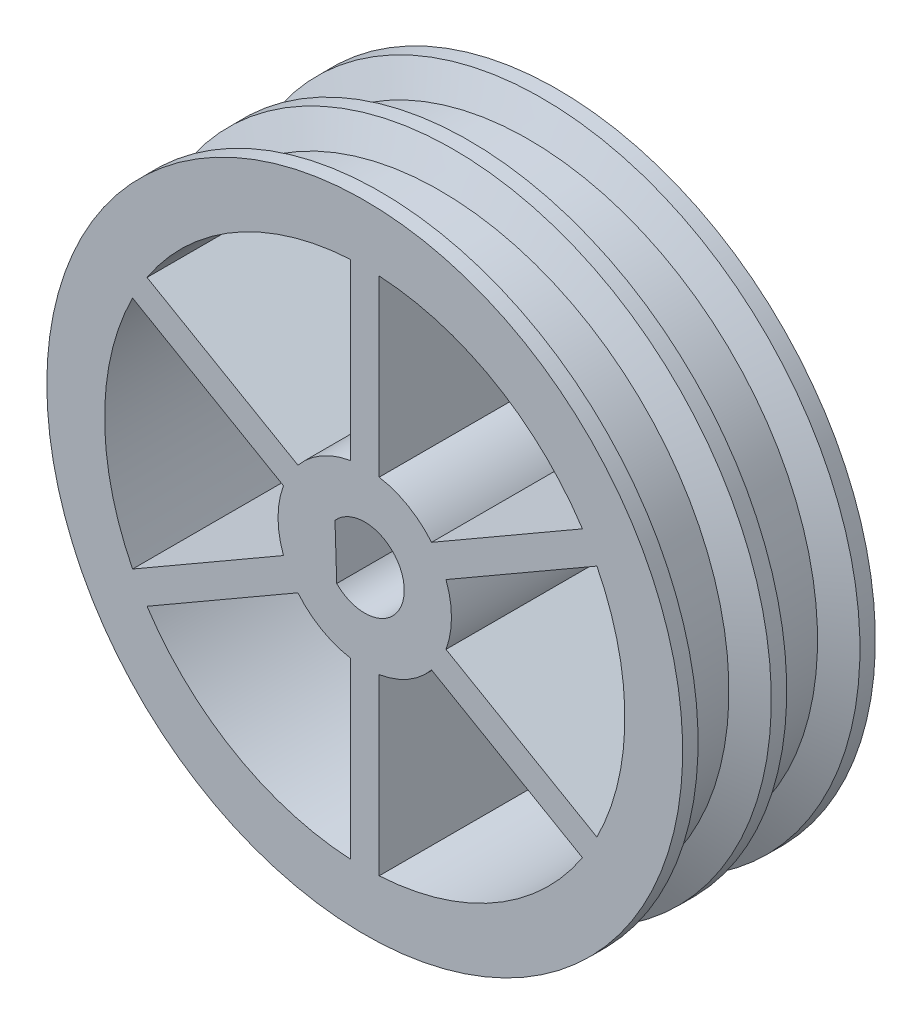
ISO-10303-21;
HEADER;
FILE_DESCRIPTION(('STEP AP214'),'2;1');
FILE_NAME('part.step','',(''),(''),'','','');
FILE_SCHEMA(('AUTOMOTIVE_DESIGN { 1 0 10303 214 1 1 1 1 }'));
ENDSEC;
DATA;
#1=APPLICATION_CONTEXT('core data for automotive mechanical design processes');
#2=APPLICATION_PROTOCOL_DEFINITION('international standard','automotive_design',2000,#1);
#3=PRODUCT_CONTEXT('',#1,'mechanical');
#4=PRODUCT('Part','Part','',(#3));
#5=PRODUCT_RELATED_PRODUCT_CATEGORY('part','',(#4));
#6=PRODUCT_DEFINITION_FORMATION('','',#4);
#7=PRODUCT_DEFINITION_CONTEXT('part definition',#1,'design');
#8=PRODUCT_DEFINITION('design','',#6,#7);
#9=PRODUCT_DEFINITION_SHAPE('','',#8);
#10=(LENGTH_UNIT() NAMED_UNIT(*) SI_UNIT(.MILLI.,.METRE.));
#11=(NAMED_UNIT(*) PLANE_ANGLE_UNIT() SI_UNIT($,.RADIAN.));
#12=(NAMED_UNIT(*) SI_UNIT($,.STERADIAN.) SOLID_ANGLE_UNIT());
#13=UNCERTAINTY_MEASURE_WITH_UNIT(LENGTH_MEASURE(1.E-05),#10,'distance_accuracy_value','');
#14=(GEOMETRIC_REPRESENTATION_CONTEXT(3) GLOBAL_UNCERTAINTY_ASSIGNED_CONTEXT((#13)) GLOBAL_UNIT_ASSIGNED_CONTEXT((#10,
#11,#12)) REPRESENTATION_CONTEXT('',''));
#15=CARTESIAN_POINT('',(0.,0.,0.));
#16=DIRECTION('',(0.,0.,1.));
#17=DIRECTION('',(1.,0.,0.));
#18=AXIS2_PLACEMENT_3D('',#15,#16,#17);
#19=CARTESIAN_POINT('',(0.,0.,20.));
#20=DIRECTION('',(0.,0.,-1.));
#21=DIRECTION('',(-1.,0.,0.));
#22=AXIS2_PLACEMENT_3D('',#19,#20,#21);
#23=CYLINDRICAL_SURFACE('',#22,30.);
#24=CARTESIAN_POINT('',(0.,0.,12.2));
#25=DIRECTION('',(0.,0.,-1.));
#26=DIRECTION('',(-1.,0.,0.));
#27=AXIS2_PLACEMENT_3D('',#24,#25,#26);
#28=CIRCLE('',#27,30.);
#29=CARTESIAN_POINT('',(-30.,0.,12.2));
#30=VERTEX_POINT('',#29);
#31=EDGE_CURVE('E640',#30,#30,#28,.T.);
#32=ORIENTED_EDGE('',*,*,#31,.F.);
#33=EDGE_LOOP('',(#32));
#34=FACE_BOUND('',#33,.T.);
#35=CARTESIAN_POINT('',(0.,0.,17.));
#36=DIRECTION('',(0.,0.,-1.));
#37=DIRECTION('',(-1.,0.,0.));
#38=AXIS2_PLACEMENT_3D('',#35,#36,#37);
#39=CIRCLE('',#38,30.);
#40=CARTESIAN_POINT('',(-30.,0.,17.));
#41=VERTEX_POINT('',#40);
#42=EDGE_CURVE('E501',#41,#41,#39,.T.);
#43=ORIENTED_EDGE('',*,*,#42,.T.);
#44=EDGE_LOOP('',(#43));
#45=FACE_BOUND('',#44,.T.);
#46=ADVANCED_FACE('F35',(#34,#45),#23,.T.);
#47=CARTESIAN_POINT('',(0.,0.,20.));
#48=DIRECTION('',(0.,0.,1.));
#49=DIRECTION('',(1.,0.,0.));
#50=AXIS2_PLACEMENT_3D('',#47,#48,#49);
#51=PLANE('',#50);
#52=DIRECTION('',(0.,1.,0.));
#53=VECTOR('',#52,1.);
#54=CARTESIAN_POINT('',(-1.5,26.9583011334171,20.));
#55=LINE('',#54,#53);
#56=CARTESIAN_POINT('',(-1.5,8.87411967464942,20.));
#57=VERTEX_POINT('',#56);
#58=CARTESIAN_POINT('',(-1.5,26.9583011334171,20.));
#59=VERTEX_POINT('',#58);
#60=EDGE_CURVE('E391',#57,#59,#55,.T.);
#61=ORIENTED_EDGE('',*,*,#60,.F.);
#62=CARTESIAN_POINT('',(0.,0.,20.));
#63=DIRECTION('',(0.,0.,-1.));
#64=DIRECTION('',(1.,0.,0.));
#65=AXIS2_PLACEMENT_3D('',#62,#63,#64);
#66=CIRCLE('',#65,9.);
#67=CARTESIAN_POINT('',(-6.93521307446963,5.73609794300145,20.));
#68=VERTEX_POINT('',#67);
#69=EDGE_CURVE('E389',#68,#57,#66,.T.);
#70=ORIENTED_EDGE('',*,*,#69,.F.);
#71=DIRECTION('',(0.866025403784433,-0.50000000000001,0.));
#72=VECTOR('',#71,1.);
#73=CARTESIAN_POINT('',(-22.5965736244099,14.7781886723855,20.));
#74=LINE('',#73,#72);
#75=CARTESIAN_POINT('',(-22.5965736244099,14.7781886723855,20.));
#76=VERTEX_POINT('',#75);
#77=EDGE_CURVE('E397',#76,#68,#74,.T.);
#78=ORIENTED_EDGE('',*,*,#77,.F.);
#79=CARTESIAN_POINT('',(0.,0.,20.));
#80=DIRECTION('',(0.,0.,1.));
#81=DIRECTION('',(1.,0.,0.));
#82=AXIS2_PLACEMENT_3D('',#79,#80,#81);
#83=CIRCLE('',#82,27.);
#84=EDGE_CURVE('E394',#59,#76,#83,.T.);
#85=ORIENTED_EDGE('',*,*,#84,.F.);
#86=EDGE_LOOP('',(#61,#70,#78,#85));
#87=FACE_BOUND('',#86,.T.);
#88=DIRECTION('',(0.86602540378444,0.499999999999998,0.));
#89=VECTOR('',#88,1.);
#90=CARTESIAN_POINT('',(22.5965736244101,14.7781886723852,20.));
#91=LINE('',#90,#89);
#92=CARTESIAN_POINT('',(6.93521307446971,5.73609794300136,20.));
#93=VERTEX_POINT('',#92);
#94=CARTESIAN_POINT('',(22.5965736244101,14.7781886723852,20.));
#95=VERTEX_POINT('',#94);
#96=EDGE_CURVE('E360',#93,#95,#91,.T.);
#97=ORIENTED_EDGE('',*,*,#96,.F.);
#98=CARTESIAN_POINT('',(0.,0.,20.));
#99=DIRECTION('',(0.,0.,-1.));
#100=DIRECTION('',(1.,0.,0.));
#101=AXIS2_PLACEMENT_3D('',#98,#99,#100);
#102=CIRCLE('',#101,9.);
#103=CARTESIAN_POINT('',(1.5,8.87411967464942,20.));
#104=VERTEX_POINT('',#103);
#105=EDGE_CURVE('E358',#104,#93,#102,.T.);
#106=ORIENTED_EDGE('',*,*,#105,.F.);
#107=DIRECTION('',(0.,-1.,0.));
#108=VECTOR('',#107,1.);
#109=CARTESIAN_POINT('',(1.5,26.9583011334171,20.));
#110=LINE('',#109,#108);
#111=CARTESIAN_POINT('',(1.5,26.9583011334171,20.));
#112=VERTEX_POINT('',#111);
#113=EDGE_CURVE('E366',#112,#104,#110,.T.);
#114=ORIENTED_EDGE('',*,*,#113,.F.);
#115=CARTESIAN_POINT('',(0.,0.,20.));
#116=DIRECTION('',(0.,0.,1.));
#117=DIRECTION('',(1.,0.,0.));
#118=AXIS2_PLACEMENT_3D('',#115,#116,#117);
#119=CIRCLE('',#118,27.);
#120=EDGE_CURVE('E363',#95,#112,#119,.T.);
#121=ORIENTED_EDGE('',*,*,#120,.F.);
#122=EDGE_LOOP('',(#97,#106,#114,#121));
#123=FACE_BOUND('',#122,.T.);
#124=DIRECTION('',(0.0322794332363587,-0.99947888331367,0.));
#125=VECTOR('',#124,1.);
#126=CARTESIAN_POINT('',(-3.08864597172414,2.6963430904379,20.));
#127=LINE('',#126,#125);
#128=CARTESIAN_POINT('',(-3.08864597172414,2.69634309043791,20.));
#129=VERTEX_POINT('',#128);
#130=CARTESIAN_POINT('',(-2.90822732815787,-2.89001968985606,20.));
#131=VERTEX_POINT('',#130);
#132=EDGE_CURVE('E344',#129,#131,#127,.T.);
#133=ORIENTED_EDGE('',*,*,#132,.F.);
#134=CARTESIAN_POINT('',(0.,0.,20.));
#135=DIRECTION('',(0.,0.,1.));
#136=DIRECTION('',(1.,0.,0.));
#137=AXIS2_PLACEMENT_3D('',#134,#135,#136);
#138=CIRCLE('',#137,4.1);
#139=EDGE_CURVE('E341',#131,#129,#138,.T.);
#140=ORIENTED_EDGE('',*,*,#139,.F.);
#141=EDGE_LOOP('',(#133,#140));
#142=FACE_BOUND('',#141,.T.);
#143=DIRECTION('',(-0.866025403784433,0.50000000000001,0.));
#144=VECTOR('',#143,1.);
#145=CARTESIAN_POINT('',(-24.0965736244099,12.1801124610322,20.));
#146=LINE('',#145,#144);
#147=CARTESIAN_POINT('',(-8.43521307446966,3.13802173164815,20.));
#148=VERTEX_POINT('',#147);
#149=CARTESIAN_POINT('',(-24.0965736244099,12.1801124610322,20.));
#150=VERTEX_POINT('',#149);
#151=EDGE_CURVE('E312',#148,#150,#146,.T.);
#152=ORIENTED_EDGE('',*,*,#151,.F.);
#153=CARTESIAN_POINT('',(0.,0.,20.));
#154=DIRECTION('',(0.,0.,-1.));
#155=DIRECTION('',(1.,0.,0.));
#156=AXIS2_PLACEMENT_3D('',#153,#154,#155);
#157=CIRCLE('',#156,9.);
#158=CARTESIAN_POINT('',(-8.43521307446973,-3.13802173164797,20.));
#159=VERTEX_POINT('',#158);
#160=EDGE_CURVE('E310',#159,#148,#157,.T.);
#161=ORIENTED_EDGE('',*,*,#160,.F.);
#162=DIRECTION('',(0.866025403784443,0.499999999999992,0.));
#163=VECTOR('',#162,1.);
#164=CARTESIAN_POINT('',(-24.0965736244102,-12.1801124610317,20.));
#165=LINE('',#164,#163);
#166=CARTESIAN_POINT('',(-24.0965736244102,-12.1801124610317,20.));
#167=VERTEX_POINT('',#166);
#168=EDGE_CURVE('E318',#167,#159,#165,.T.);
#169=ORIENTED_EDGE('',*,*,#168,.F.);
#170=CARTESIAN_POINT('',(0.,0.,20.));
#171=DIRECTION('',(0.,0.,1.));
#172=DIRECTION('',(1.,0.,0.));
#173=AXIS2_PLACEMENT_3D('',#170,#171,#172);
#174=CIRCLE('',#173,27.);
#175=EDGE_CURVE('E315',#150,#167,#174,.T.);
#176=ORIENTED_EDGE('',*,*,#175,.F.);
#177=EDGE_LOOP('',(#152,#161,#169,#176));
#178=FACE_BOUND('',#177,.T.);
#179=DIRECTION('',(0.866025403784436,-0.500000000000004,0.));
#180=VECTOR('',#179,1.);
#181=CARTESIAN_POINT('',(24.09657362441,-12.180112461032,20.));
#182=LINE('',#181,#180);
#183=CARTESIAN_POINT('',(8.43521307446969,-3.13802173164809,20.));
#184=VERTEX_POINT('',#183);
#185=CARTESIAN_POINT('',(24.09657362441,-12.180112461032,20.));
#186=VERTEX_POINT('',#185);
#187=EDGE_CURVE('E281',#184,#186,#182,.T.);
#188=ORIENTED_EDGE('',*,*,#187,.F.);
#189=CARTESIAN_POINT('',(0.,0.,20.));
#190=DIRECTION('',(0.,0.,-1.));
#191=DIRECTION('',(1.,0.,0.));
#192=AXIS2_PLACEMENT_3D('',#189,#190,#191);
#193=CIRCLE('',#192,9.);
#194=CARTESIAN_POINT('',(8.43521307446971,3.13802173164803,20.));
#195=VERTEX_POINT('',#194);
#196=EDGE_CURVE('E279',#195,#184,#193,.T.);
#197=ORIENTED_EDGE('',*,*,#196,.F.);
#198=DIRECTION('',(-0.86602540378444,-0.499999999999998,0.));
#199=VECTOR('',#198,1.);
#200=CARTESIAN_POINT('',(24.0965736244101,12.1801124610319,20.));
#201=LINE('',#200,#199);
#202=CARTESIAN_POINT('',(24.0965736244101,12.1801124610319,20.));
#203=VERTEX_POINT('',#202);
#204=EDGE_CURVE('E287',#203,#195,#201,.T.);
#205=ORIENTED_EDGE('',*,*,#204,.F.);
#206=CARTESIAN_POINT('',(0.,0.,20.));
#207=DIRECTION('',(0.,0.,1.));
#208=DIRECTION('',(1.,0.,0.));
#209=AXIS2_PLACEMENT_3D('',#206,#207,#208);
#210=CIRCLE('',#209,27.);
#211=EDGE_CURVE('E284',#186,#203,#210,.T.);
#212=ORIENTED_EDGE('',*,*,#211,.F.);
#213=EDGE_LOOP('',(#188,#197,#205,#212));
#214=FACE_BOUND('',#213,.T.);
#215=DIRECTION('',(-0.866025403784443,-0.499999999999992,0.));
#216=VECTOR('',#215,1.);
#217=CARTESIAN_POINT('',(-22.5965736244102,-14.778188672385,20.));
#218=LINE('',#217,#216);
#219=CARTESIAN_POINT('',(-6.93521307446975,-5.73609794300131,20.));
#220=VERTEX_POINT('',#219);
#221=CARTESIAN_POINT('',(-22.5965736244102,-14.778188672385,20.));
#222=VERTEX_POINT('',#221);
#223=EDGE_CURVE('E250',#220,#222,#218,.T.);
#224=ORIENTED_EDGE('',*,*,#223,.F.);
#225=CARTESIAN_POINT('',(0.,0.,20.));
#226=DIRECTION('',(0.,0.,-1.));
#227=DIRECTION('',(1.,0.,0.));
#228=AXIS2_PLACEMENT_3D('',#225,#226,#227);
#229=CIRCLE('',#228,9.);
#230=CARTESIAN_POINT('',(-1.50000000000006,-8.87411967464941,20.));
#231=VERTEX_POINT('',#230);
#232=EDGE_CURVE('E248',#231,#220,#229,.T.);
#233=ORIENTED_EDGE('',*,*,#232,.F.);
#234=DIRECTION('',(0.,1.,0.));
#235=VECTOR('',#234,1.);
#236=CARTESIAN_POINT('',(-1.50000000000019,-26.9583011334171,20.));
#237=LINE('',#236,#235);
#238=CARTESIAN_POINT('',(-1.50000000000019,-26.9583011334171,20.));
#239=VERTEX_POINT('',#238);
#240=EDGE_CURVE('E256',#239,#231,#237,.T.);
#241=ORIENTED_EDGE('',*,*,#240,.F.);
#242=CARTESIAN_POINT('',(0.,0.,20.));
#243=DIRECTION('',(0.,0.,1.));
#244=DIRECTION('',(1.,0.,0.));
#245=AXIS2_PLACEMENT_3D('',#242,#243,#244);
#246=CIRCLE('',#245,27.);
#247=EDGE_CURVE('E253',#222,#239,#246,.T.);
#248=ORIENTED_EDGE('',*,*,#247,.F.);
#249=EDGE_LOOP('',(#224,#233,#241,#248));
#250=FACE_BOUND('',#249,.T.);
#251=DIRECTION('',(0.,-1.,0.));
#252=VECTOR('',#251,1.);
#253=CARTESIAN_POINT('',(1.49999999999981,-26.9583011334172,20.));
#254=LINE('',#253,#252);
#255=CARTESIAN_POINT('',(1.49999999999994,-8.87411967464944,20.));
#256=VERTEX_POINT('',#255);
#257=CARTESIAN_POINT('',(1.4999999999998,-26.9583011334172,20.));
#258=VERTEX_POINT('',#257);
#259=EDGE_CURVE('E216',#256,#258,#254,.T.);
#260=ORIENTED_EDGE('',*,*,#259,.F.);
#261=CARTESIAN_POINT('',(0.,0.,20.));
#262=DIRECTION('',(0.,0.,-1.));
#263=DIRECTION('',(1.,0.,0.));
#264=AXIS2_PLACEMENT_3D('',#261,#262,#263);
#265=CIRCLE('',#264,9.);
#266=CARTESIAN_POINT('',(6.93521307446967,-5.7360979430014,20.));
#267=VERTEX_POINT('',#266);
#268=EDGE_CURVE('E208',#267,#256,#265,.T.);
#269=ORIENTED_EDGE('',*,*,#268,.F.);
#270=DIRECTION('',(-0.866025403784436,0.500000000000004,0.));
#271=VECTOR('',#270,1.);
#272=CARTESIAN_POINT('',(22.59657362441,-14.7781886723853,20.));
#273=LINE('',#272,#271);
#274=CARTESIAN_POINT('',(22.59657362441,-14.7781886723853,20.));
#275=VERTEX_POINT('',#274);
#276=EDGE_CURVE('E232',#275,#267,#273,.T.);
#277=ORIENTED_EDGE('',*,*,#276,.F.);
#278=CARTESIAN_POINT('',(0.,0.,20.));
#279=DIRECTION('',(0.,0.,1.));
#280=DIRECTION('',(1.,0.,0.));
#281=AXIS2_PLACEMENT_3D('',#278,#279,#280);
#282=CIRCLE('',#281,27.);
#283=EDGE_CURVE('E230',#258,#275,#282,.T.);
#284=ORIENTED_EDGE('',*,*,#283,.F.);
#285=EDGE_LOOP('',(#260,#269,#277,#284));
#286=FACE_BOUND('',#285,.T.);
#287=CARTESIAN_POINT('',(0.,0.,20.));
#288=DIRECTION('',(0.,0.,-1.));
#289=DIRECTION('',(-1.,0.,0.));
#290=AXIS2_PLACEMENT_3D('',#287,#288,#289);
#291=CIRCLE('',#290,33.);
#292=CARTESIAN_POINT('',(-33.,0.,20.));
#293=VERTEX_POINT('',#292);
#294=EDGE_CURVE('E506',#293,#293,#291,.T.);
#295=ORIENTED_EDGE('',*,*,#294,.F.);
#296=EDGE_LOOP('',(#295));
#297=FACE_BOUND('',#296,.T.);
#298=ADVANCED_FACE('F228',(#87,#123,#142,#178,#214,#250,#286,#297),#51,.T.);
#299=CARTESIAN_POINT('',(0.,0.,0.));
#300=DIRECTION('',(0.,0.,1.));
#301=DIRECTION('',(1.,0.,0.));
#302=AXIS2_PLACEMENT_3D('',#299,#300,#301);
#303=PLANE('',#302);
#304=CARTESIAN_POINT('',(0.,0.,0.));
#305=DIRECTION('',(0.,0.,-1.));
#306=DIRECTION('',(1.,0.,0.));
#307=AXIS2_PLACEMENT_3D('',#304,#305,#306);
#308=CIRCLE('',#307,9.);
#309=CARTESIAN_POINT('',(-1.50000000000006,-8.87411967464941,0.));
#310=VERTEX_POINT('',#309);
#311=CARTESIAN_POINT('',(-6.93521307446975,-5.73609794300131,0.));
#312=VERTEX_POINT('',#311);
#313=EDGE_CURVE('E224',#310,#312,#308,.T.);
#314=ORIENTED_EDGE('',*,*,#313,.T.);
#315=DIRECTION('',(-0.866025403784443,-0.499999999999992,0.));
#316=VECTOR('',#315,1.);
#317=CARTESIAN_POINT('',(-22.5965736244102,-14.778188672385,0.));
#318=LINE('',#317,#316);
#319=CARTESIAN_POINT('',(-22.5965736244102,-14.778188672385,0.));
#320=VERTEX_POINT('',#319);
#321=EDGE_CURVE('E261',#312,#320,#318,.T.);
#322=ORIENTED_EDGE('',*,*,#321,.T.);
#323=CARTESIAN_POINT('',(0.,0.,0.));
#324=DIRECTION('',(0.,0.,1.));
#325=DIRECTION('',(1.,0.,0.));
#326=AXIS2_PLACEMENT_3D('',#323,#324,#325);
#327=CIRCLE('',#326,27.);
#328=CARTESIAN_POINT('',(-1.50000000000019,-26.9583011334171,0.));
#329=VERTEX_POINT('',#328);
#330=EDGE_CURVE('E264',#320,#329,#327,.T.);
#331=ORIENTED_EDGE('',*,*,#330,.T.);
#332=DIRECTION('',(0.,1.,0.));
#333=VECTOR('',#332,1.);
#334=CARTESIAN_POINT('',(-1.50000000000019,-26.9583011334171,0.));
#335=LINE('',#334,#333);
#336=EDGE_CURVE('E251',#329,#310,#335,.T.);
#337=ORIENTED_EDGE('',*,*,#336,.T.);
#338=EDGE_LOOP('',(#314,#322,#331,#337));
#339=FACE_BOUND('',#338,.T.);
#340=CARTESIAN_POINT('',(0.,0.,0.));
#341=DIRECTION('',(0.,0.,-1.));
#342=DIRECTION('',(1.,0.,0.));
#343=AXIS2_PLACEMENT_3D('',#340,#341,#342);
#344=CIRCLE('',#343,9.);
#345=CARTESIAN_POINT('',(-8.43521307446973,-3.13802173164797,0.));
#346=VERTEX_POINT('',#345);
#347=CARTESIAN_POINT('',(-8.43521307446966,3.13802173164815,0.));
#348=VERTEX_POINT('',#347);
#349=EDGE_CURVE('E309',#346,#348,#344,.T.);
#350=ORIENTED_EDGE('',*,*,#349,.T.);
#351=DIRECTION('',(-0.866025403784433,0.50000000000001,0.));
#352=VECTOR('',#351,1.);
#353=CARTESIAN_POINT('',(-24.0965736244099,12.1801124610322,0.));
#354=LINE('',#353,#352);
#355=CARTESIAN_POINT('',(-24.0965736244099,12.1801124610322,0.));
#356=VERTEX_POINT('',#355);
#357=EDGE_CURVE('E323',#348,#356,#354,.T.);
#358=ORIENTED_EDGE('',*,*,#357,.T.);
#359=CARTESIAN_POINT('',(0.,0.,0.));
#360=DIRECTION('',(0.,0.,1.));
#361=DIRECTION('',(1.,0.,0.));
#362=AXIS2_PLACEMENT_3D('',#359,#360,#361);
#363=CIRCLE('',#362,27.);
#364=CARTESIAN_POINT('',(-24.0965736244102,-12.1801124610317,0.));
#365=VERTEX_POINT('',#364);
#366=EDGE_CURVE('E326',#356,#365,#363,.T.);
#367=ORIENTED_EDGE('',*,*,#366,.T.);
#368=DIRECTION('',(0.866025403784443,0.499999999999992,0.));
#369=VECTOR('',#368,1.);
#370=CARTESIAN_POINT('',(-24.0965736244102,-12.1801124610317,0.));
#371=LINE('',#370,#369);
#372=EDGE_CURVE('E313',#365,#346,#371,.T.);
#373=ORIENTED_EDGE('',*,*,#372,.T.);
#374=EDGE_LOOP('',(#350,#358,#367,#373));
#375=FACE_BOUND('',#374,.T.);
#376=CARTESIAN_POINT('',(0.,0.,0.));
#377=DIRECTION('',(0.,0.,-1.));
#378=DIRECTION('',(1.,0.,0.));
#379=AXIS2_PLACEMENT_3D('',#376,#377,#378);
#380=CIRCLE('',#379,9.);
#381=CARTESIAN_POINT('',(1.5,8.87411967464942,0.));
#382=VERTEX_POINT('',#381);
#383=CARTESIAN_POINT('',(6.93521307446971,5.73609794300136,0.));
#384=VERTEX_POINT('',#383);
#385=EDGE_CURVE('E357',#382,#384,#380,.T.);
#386=ORIENTED_EDGE('',*,*,#385,.T.);
#387=DIRECTION('',(0.86602540378444,0.499999999999998,0.));
#388=VECTOR('',#387,1.);
#389=CARTESIAN_POINT('',(22.5965736244101,14.7781886723852,0.));
#390=LINE('',#389,#388);
#391=CARTESIAN_POINT('',(22.5965736244101,14.7781886723852,0.));
#392=VERTEX_POINT('',#391);
#393=EDGE_CURVE('E371',#384,#392,#390,.T.);
#394=ORIENTED_EDGE('',*,*,#393,.T.);
#395=CARTESIAN_POINT('',(0.,0.,0.));
#396=DIRECTION('',(0.,0.,1.));
#397=DIRECTION('',(1.,0.,0.));
#398=AXIS2_PLACEMENT_3D('',#395,#396,#397);
#399=CIRCLE('',#398,27.);
#400=CARTESIAN_POINT('',(1.5,26.9583011334171,0.));
#401=VERTEX_POINT('',#400);
#402=EDGE_CURVE('E374',#392,#401,#399,.T.);
#403=ORIENTED_EDGE('',*,*,#402,.T.);
#404=DIRECTION('',(0.,-1.,0.));
#405=VECTOR('',#404,1.);
#406=CARTESIAN_POINT('',(1.5,26.9583011334171,0.));
#407=LINE('',#406,#405);
#408=EDGE_CURVE('E361',#401,#382,#407,.T.);
#409=ORIENTED_EDGE('',*,*,#408,.T.);
#410=EDGE_LOOP('',(#386,#394,#403,#409));
#411=FACE_BOUND('',#410,.T.);
#412=CARTESIAN_POINT('',(0.,0.,0.));
#413=DIRECTION('',(0.,0.,-1.));
#414=DIRECTION('',(1.,0.,0.));
#415=AXIS2_PLACEMENT_3D('',#412,#413,#414);
#416=CIRCLE('',#415,9.);
#417=CARTESIAN_POINT('',(-6.93521307446963,5.73609794300145,0.));
#418=VERTEX_POINT('',#417);
#419=CARTESIAN_POINT('',(-1.5,8.87411967464942,0.));
#420=VERTEX_POINT('',#419);
#421=EDGE_CURVE('E388',#418,#420,#416,.T.);
#422=ORIENTED_EDGE('',*,*,#421,.T.);
#423=DIRECTION('',(0.,1.,0.));
#424=VECTOR('',#423,1.);
#425=CARTESIAN_POINT('',(-1.5,26.9583011334171,0.));
#426=LINE('',#425,#424);
#427=CARTESIAN_POINT('',(-1.5,26.9583011334171,0.));
#428=VERTEX_POINT('',#427);
#429=EDGE_CURVE('E402',#420,#428,#426,.T.);
#430=ORIENTED_EDGE('',*,*,#429,.T.);
#431=CARTESIAN_POINT('',(0.,0.,0.));
#432=DIRECTION('',(0.,0.,1.));
#433=DIRECTION('',(1.,0.,0.));
#434=AXIS2_PLACEMENT_3D('',#431,#432,#433);
#435=CIRCLE('',#434,27.);
#436=CARTESIAN_POINT('',(-22.5965736244099,14.7781886723855,0.));
#437=VERTEX_POINT('',#436);
#438=EDGE_CURVE('E405',#428,#437,#435,.T.);
#439=ORIENTED_EDGE('',*,*,#438,.T.);
#440=DIRECTION('',(0.866025403784433,-0.50000000000001,0.));
#441=VECTOR('',#440,1.);
#442=CARTESIAN_POINT('',(-22.5965736244099,14.7781886723855,0.));
#443=LINE('',#442,#441);
#444=EDGE_CURVE('E392',#437,#418,#443,.T.);
#445=ORIENTED_EDGE('',*,*,#444,.T.);
#446=EDGE_LOOP('',(#422,#430,#439,#445));
#447=FACE_BOUND('',#446,.T.);
#448=CARTESIAN_POINT('',(0.,0.,0.));
#449=DIRECTION('',(0.,0.,1.));
#450=DIRECTION('',(1.,0.,0.));
#451=AXIS2_PLACEMENT_3D('',#448,#449,#450);
#452=CIRCLE('',#451,4.1);
#453=CARTESIAN_POINT('',(-2.90822732815788,-2.89001968985606,0.));
#454=VERTEX_POINT('',#453);
#455=CARTESIAN_POINT('',(-3.08864597172414,2.6963430904379,0.));
#456=VERTEX_POINT('',#455);
#457=EDGE_CURVE('E340',#454,#456,#452,.T.);
#458=ORIENTED_EDGE('',*,*,#457,.T.);
#459=DIRECTION('',(0.0322794332363587,-0.99947888331367,0.));
#460=VECTOR('',#459,1.);
#461=CARTESIAN_POINT('',(-3.08864597172414,2.6963430904379,0.));
#462=LINE('',#461,#460);
#463=EDGE_CURVE('E345',#456,#454,#462,.T.);
#464=ORIENTED_EDGE('',*,*,#463,.T.);
#465=EDGE_LOOP('',(#458,#464));
#466=FACE_BOUND('',#465,.T.);
#467=CARTESIAN_POINT('',(0.,0.,0.));
#468=DIRECTION('',(0.,0.,-1.));
#469=DIRECTION('',(1.,0.,0.));
#470=AXIS2_PLACEMENT_3D('',#467,#468,#469);
#471=CIRCLE('',#470,9.);
#472=CARTESIAN_POINT('',(8.43521307446971,3.13802173164803,0.));
#473=VERTEX_POINT('',#472);
#474=CARTESIAN_POINT('',(8.43521307446969,-3.13802173164809,0.));
#475=VERTEX_POINT('',#474);
#476=EDGE_CURVE('E278',#473,#475,#471,.T.);
#477=ORIENTED_EDGE('',*,*,#476,.T.);
#478=DIRECTION('',(0.866025403784436,-0.500000000000004,0.));
#479=VECTOR('',#478,1.);
#480=CARTESIAN_POINT('',(24.09657362441,-12.180112461032,0.));
#481=LINE('',#480,#479);
#482=CARTESIAN_POINT('',(24.09657362441,-12.180112461032,0.));
#483=VERTEX_POINT('',#482);
#484=EDGE_CURVE('E292',#475,#483,#481,.T.);
#485=ORIENTED_EDGE('',*,*,#484,.T.);
#486=CARTESIAN_POINT('',(0.,0.,0.));
#487=DIRECTION('',(0.,0.,1.));
#488=DIRECTION('',(1.,0.,0.));
#489=AXIS2_PLACEMENT_3D('',#486,#487,#488);
#490=CIRCLE('',#489,27.);
#491=CARTESIAN_POINT('',(24.0965736244101,12.1801124610319,0.));
#492=VERTEX_POINT('',#491);
#493=EDGE_CURVE('E295',#483,#492,#490,.T.);
#494=ORIENTED_EDGE('',*,*,#493,.T.);
#495=DIRECTION('',(-0.86602540378444,-0.499999999999998,0.));
#496=VECTOR('',#495,1.);
#497=CARTESIAN_POINT('',(24.0965736244101,12.1801124610319,0.));
#498=LINE('',#497,#496);
#499=EDGE_CURVE('E282',#492,#473,#498,.T.);
#500=ORIENTED_EDGE('',*,*,#499,.T.);
#501=EDGE_LOOP('',(#477,#485,#494,#500));
#502=FACE_BOUND('',#501,.T.);
#503=CARTESIAN_POINT('',(0.,0.,0.));
#504=DIRECTION('',(0.,0.,-1.));
#505=DIRECTION('',(1.,0.,0.));
#506=AXIS2_PLACEMENT_3D('',#503,#504,#505);
#507=CIRCLE('',#506,9.);
#508=CARTESIAN_POINT('',(6.93521307446967,-5.7360979430014,0.));
#509=VERTEX_POINT('',#508);
#510=CARTESIAN_POINT('',(1.49999999999994,-8.87411967464944,0.));
#511=VERTEX_POINT('',#510);
#512=EDGE_CURVE('E58',#509,#511,#507,.T.);
#513=ORIENTED_EDGE('',*,*,#512,.T.);
#514=DIRECTION('',(0.,-1.,0.));
#515=VECTOR('',#514,1.);
#516=CARTESIAN_POINT('',(1.49999999999981,-26.9583011334172,0.));
#517=LINE('',#516,#515);
#518=CARTESIAN_POINT('',(1.4999999999998,-26.9583011334172,0.));
#519=VERTEX_POINT('',#518);
#520=EDGE_CURVE('E223',#511,#519,#517,.T.);
#521=ORIENTED_EDGE('',*,*,#520,.T.);
#522=CARTESIAN_POINT('',(0.,0.,0.));
#523=DIRECTION('',(0.,0.,1.));
#524=DIRECTION('',(1.,0.,0.));
#525=AXIS2_PLACEMENT_3D('',#522,#523,#524);
#526=CIRCLE('',#525,27.);
#527=CARTESIAN_POINT('',(22.59657362441,-14.7781886723853,0.));
#528=VERTEX_POINT('',#527);
#529=EDGE_CURVE('E240',#519,#528,#526,.T.);
#530=ORIENTED_EDGE('',*,*,#529,.T.);
#531=DIRECTION('',(-0.866025403784436,0.500000000000004,0.));
#532=VECTOR('',#531,1.);
#533=CARTESIAN_POINT('',(22.59657362441,-14.7781886723853,0.));
#534=LINE('',#533,#532);
#535=EDGE_CURVE('E217',#528,#509,#534,.T.);
#536=ORIENTED_EDGE('',*,*,#535,.T.);
#537=EDGE_LOOP('',(#513,#521,#530,#536));
#538=FACE_BOUND('',#537,.T.);
#539=CARTESIAN_POINT('',(0.,0.,0.));
#540=DIRECTION('',(0.,0.,-1.));
#541=DIRECTION('',(-1.,0.,0.));
#542=AXIS2_PLACEMENT_3D('',#539,#540,#541);
#543=CIRCLE('',#542,33.);
#544=CARTESIAN_POINT('',(-33.,0.,0.));
#545=VERTEX_POINT('',#544);
#546=EDGE_CURVE('E238',#545,#545,#543,.T.);
#547=ORIENTED_EDGE('',*,*,#546,.T.);
#548=EDGE_LOOP('',(#547));
#549=FACE_BOUND('',#548,.T.);
#550=ADVANCED_FACE('F424',(#339,#375,#411,#447,#466,#502,#538,#549),#303,.F.);
#551=CARTESIAN_POINT('',(0.,0.,7.8));
#552=DIRECTION('',(0.,0.,-1.));
#553=DIRECTION('',(-1.,0.,0.));
#554=AXIS2_PLACEMENT_3D('',#551,#552,#553);
#555=CIRCLE('',#554,30.);
#556=CARTESIAN_POINT('',(-30.,0.,7.8));
#557=VERTEX_POINT('',#556);
#558=EDGE_CURVE('E495',#557,#557,#555,.T.);
#559=ORIENTED_EDGE('',*,*,#558,.T.);
#560=EDGE_LOOP('',(#559));
#561=FACE_BOUND('',#560,.T.);
#562=CARTESIAN_POINT('',(0.,0.,3.));
#563=DIRECTION('',(0.,0.,-1.));
#564=DIRECTION('',(-1.,0.,0.));
#565=AXIS2_PLACEMENT_3D('',#562,#563,#564);
#566=CIRCLE('',#565,30.);
#567=CARTESIAN_POINT('',(-30.,0.,3.));
#568=VERTEX_POINT('',#567);
#569=EDGE_CURVE('E498',#568,#568,#566,.T.);
#570=ORIENTED_EDGE('',*,*,#569,.F.);
#571=EDGE_LOOP('',(#570));
#572=FACE_BOUND('',#571,.T.);
#573=ADVANCED_FACE('F37',(#561,#572),#23,.T.);
#574=CARTESIAN_POINT('',(0.,0.,20.));
#575=DIRECTION('',(0.,0.,-1.));
#576=DIRECTION('',(-1.,0.,0.));
#577=AXIS2_PLACEMENT_3D('',#574,#575,#576);
#578=CYLINDRICAL_SURFACE('',#577,9.);
#579=ORIENTED_EDGE('',*,*,#421,.F.);
#580=DIRECTION('',(0.,0.,-1.));
#581=VECTOR('',#580,1.);
#582=CARTESIAN_POINT('',(-6.93521307446963,5.73609794300145,20.));
#583=LINE('',#582,#581);
#584=EDGE_CURVE('E399',#68,#418,#583,.T.);
#585=ORIENTED_EDGE('',*,*,#584,.F.);
#586=ORIENTED_EDGE('',*,*,#69,.T.);
#587=DIRECTION('',(0.,0.,-1.));
#588=VECTOR('',#587,1.);
#589=CARTESIAN_POINT('',(-1.5,8.87411967464942,20.));
#590=LINE('',#589,#588);
#591=EDGE_CURVE('E11',#57,#420,#590,.T.);
#592=ORIENTED_EDGE('',*,*,#591,.T.);
#593=EDGE_LOOP('',(#579,#585,#586,#592));
#594=FACE_BOUND('',#593,.T.);
#595=ADVANCED_FACE('F428',(#594),#578,.T.);
#596=CARTESIAN_POINT('',(-1.5,26.9583011334171,20.));
#597=DIRECTION('',(-1.,0.,0.));
#598=DIRECTION('',(0.,-1.,0.));
#599=AXIS2_PLACEMENT_3D('',#596,#597,#598);
#600=PLANE('',#599);
#601=ORIENTED_EDGE('',*,*,#429,.F.);
#602=ORIENTED_EDGE('',*,*,#591,.F.);
#603=ORIENTED_EDGE('',*,*,#60,.T.);
#604=DIRECTION('',(0.,0.,-1.));
#605=VECTOR('',#604,1.);
#606=CARTESIAN_POINT('',(-1.5,26.9583011334171,20.));
#607=LINE('',#606,#605);
#608=EDGE_CURVE('E43',#59,#428,#607,.T.);
#609=ORIENTED_EDGE('',*,*,#608,.T.);
#610=EDGE_LOOP('',(#601,#602,#603,#609));
#611=FACE_BOUND('',#610,.T.);
#612=ADVANCED_FACE('F416',(#611),#600,.T.);
#613=CARTESIAN_POINT('',(0.,0.,20.));
#614=DIRECTION('',(0.,0.,-1.));
#615=DIRECTION('',(-1.,0.,0.));
#616=AXIS2_PLACEMENT_3D('',#613,#614,#615);
#617=CYLINDRICAL_SURFACE('',#616,27.);
#618=ORIENTED_EDGE('',*,*,#438,.F.);
#619=ORIENTED_EDGE('',*,*,#608,.F.);
#620=ORIENTED_EDGE('',*,*,#84,.T.);
#621=DIRECTION('',(0.,0.,-1.));
#622=VECTOR('',#621,1.);
#623=CARTESIAN_POINT('',(-22.5965736244099,14.7781886723855,20.));
#624=LINE('',#623,#622);
#625=EDGE_CURVE('E412',#76,#437,#624,.T.);
#626=ORIENTED_EDGE('',*,*,#625,.T.);
#627=EDGE_LOOP('',(#618,#619,#620,#626));
#628=FACE_BOUND('',#627,.T.);
#629=ADVANCED_FACE('F421',(#628),#617,.F.);
#630=CARTESIAN_POINT('',(-22.5965736244099,14.7781886723855,20.));
#631=DIRECTION('',(0.50000000000001,0.866025403784433,0.));
#632=DIRECTION('',(-0.866025403784433,0.50000000000001,0.));
#633=AXIS2_PLACEMENT_3D('',#630,#631,#632);
#634=PLANE('',#633);
#635=ORIENTED_EDGE('',*,*,#444,.F.);
#636=ORIENTED_EDGE('',*,*,#625,.F.);
#637=ORIENTED_EDGE('',*,*,#77,.T.);
#638=ORIENTED_EDGE('',*,*,#584,.T.);
#639=EDGE_LOOP('',(#635,#636,#637,#638));
#640=FACE_BOUND('',#639,.T.);
#641=ADVANCED_FACE('F431',(#640),#634,.T.);
#642=CARTESIAN_POINT('',(0.,0.,20.));
#643=DIRECTION('',(0.,0.,-1.));
#644=DIRECTION('',(-1.,0.,0.));
#645=AXIS2_PLACEMENT_3D('',#642,#643,#644);
#646=CYLINDRICAL_SURFACE('',#645,9.);
#647=ORIENTED_EDGE('',*,*,#385,.F.);
#648=DIRECTION('',(0.,0.,-1.));
#649=VECTOR('',#648,1.);
#650=CARTESIAN_POINT('',(1.5,8.87411967464942,20.));
#651=LINE('',#650,#649);
#652=EDGE_CURVE('E368',#104,#382,#651,.T.);
#653=ORIENTED_EDGE('',*,*,#652,.F.);
#654=ORIENTED_EDGE('',*,*,#105,.T.);
#655=DIRECTION('',(0.,0.,-1.));
#656=VECTOR('',#655,1.);
#657=CARTESIAN_POINT('',(6.93521307446971,5.73609794300136,20.));
#658=LINE('',#657,#656);
#659=EDGE_CURVE('E385',#93,#384,#658,.T.);
#660=ORIENTED_EDGE('',*,*,#659,.T.);
#661=EDGE_LOOP('',(#647,#653,#654,#660));
#662=FACE_BOUND('',#661,.T.);
#663=ADVANCED_FACE('F680',(#662),#646,.T.);
#664=CARTESIAN_POINT('',(22.5965736244101,14.7781886723852,20.));
#665=DIRECTION('',(-0.499999999999998,0.86602540378444,0.));
#666=DIRECTION('',(-0.86602540378444,-0.499999999999998,0.));
#667=AXIS2_PLACEMENT_3D('',#664,#665,#666);
#668=PLANE('',#667);
#669=ORIENTED_EDGE('',*,*,#393,.F.);
#670=ORIENTED_EDGE('',*,*,#659,.F.);
#671=ORIENTED_EDGE('',*,*,#96,.T.);
#672=DIRECTION('',(0.,0.,-1.));
#673=VECTOR('',#672,1.);
#674=CARTESIAN_POINT('',(22.5965736244101,14.7781886723852,20.));
#675=LINE('',#674,#673);
#676=EDGE_CURVE('E383',#95,#392,#675,.T.);
#677=ORIENTED_EDGE('',*,*,#676,.T.);
#678=EDGE_LOOP('',(#669,#670,#671,#677));
#679=FACE_BOUND('',#678,.T.);
#680=ADVANCED_FACE('F688',(#679),#668,.T.);
#681=CARTESIAN_POINT('',(0.,0.,20.));
#682=DIRECTION('',(0.,0.,-1.));
#683=DIRECTION('',(-1.,0.,0.));
#684=AXIS2_PLACEMENT_3D('',#681,#682,#683);
#685=CYLINDRICAL_SURFACE('',#684,27.);
#686=ORIENTED_EDGE('',*,*,#402,.F.);
#687=ORIENTED_EDGE('',*,*,#676,.F.);
#688=ORIENTED_EDGE('',*,*,#120,.T.);
#689=DIRECTION('',(0.,0.,-1.));
#690=VECTOR('',#689,1.);
#691=CARTESIAN_POINT('',(1.5,26.9583011334171,20.));
#692=LINE('',#691,#690);
#693=EDGE_CURVE('E381',#112,#401,#692,.T.);
#694=ORIENTED_EDGE('',*,*,#693,.T.);
#695=EDGE_LOOP('',(#686,#687,#688,#694));
#696=FACE_BOUND('',#695,.T.);
#697=ADVANCED_FACE('F697',(#696),#685,.F.);
#698=CARTESIAN_POINT('',(1.5,26.9583011334171,20.));
#699=DIRECTION('',(1.,0.,0.));
#700=DIRECTION('',(0.,1.,0.));
#701=AXIS2_PLACEMENT_3D('',#698,#699,#700);
#702=PLANE('',#701);
#703=ORIENTED_EDGE('',*,*,#408,.F.);
#704=ORIENTED_EDGE('',*,*,#693,.F.);
#705=ORIENTED_EDGE('',*,*,#113,.T.);
#706=ORIENTED_EDGE('',*,*,#652,.T.);
#707=EDGE_LOOP('',(#703,#704,#705,#706));
#708=FACE_BOUND('',#707,.T.);
#709=ADVANCED_FACE('F706',(#708),#702,.T.);
#710=CARTESIAN_POINT('',(0.,0.,20.));
#711=DIRECTION('',(0.,0.,-1.));
#712=DIRECTION('',(-1.,0.,0.));
#713=AXIS2_PLACEMENT_3D('',#710,#711,#712);
#714=CYLINDRICAL_SURFACE('',#713,4.1);
#715=ORIENTED_EDGE('',*,*,#457,.F.);
#716=DIRECTION('',(0.,0.,-1.));
#717=VECTOR('',#716,1.);
#718=CARTESIAN_POINT('',(-2.90822732815787,-2.89001968985606,20.));
#719=LINE('',#718,#717);
#720=EDGE_CURVE('E347',#131,#454,#719,.T.);
#721=ORIENTED_EDGE('',*,*,#720,.F.);
#722=ORIENTED_EDGE('',*,*,#139,.T.);
#723=DIRECTION('',(0.,0.,-1.));
#724=VECTOR('',#723,1.);
#725=CARTESIAN_POINT('',(-3.08864597172414,2.6963430904379,20.));
#726=LINE('',#725,#724);
#727=EDGE_CURVE('E354',#129,#456,#726,.T.);
#728=ORIENTED_EDGE('',*,*,#727,.T.);
#729=EDGE_LOOP('',(#715,#721,#722,#728));
#730=FACE_BOUND('',#729,.T.);
#731=ADVANCED_FACE('F715',(#730),#714,.F.);
#732=CARTESIAN_POINT('',(-3.08864597172414,2.6963430904379,20.));
#733=DIRECTION('',(0.999478883313669,0.0322794332363587,0.));
#734=DIRECTION('',(-0.0322794332363587,0.999478883313669,0.));
#735=AXIS2_PLACEMENT_3D('',#732,#733,#734);
#736=PLANE('',#735);
#737=ORIENTED_EDGE('',*,*,#463,.F.);
#738=ORIENTED_EDGE('',*,*,#727,.F.);
#739=ORIENTED_EDGE('',*,*,#132,.T.);
#740=ORIENTED_EDGE('',*,*,#720,.T.);
#741=EDGE_LOOP('',(#737,#738,#739,#740));
#742=FACE_BOUND('',#741,.T.);
#743=ADVANCED_FACE('F724',(#742),#736,.T.);
#744=CARTESIAN_POINT('',(0.,0.,20.));
#745=DIRECTION('',(0.,0.,-1.));
#746=DIRECTION('',(-1.,0.,0.));
#747=AXIS2_PLACEMENT_3D('',#744,#745,#746);
#748=CYLINDRICAL_SURFACE('',#747,9.);
#749=ORIENTED_EDGE('',*,*,#349,.F.);
#750=DIRECTION('',(0.,0.,-1.));
#751=VECTOR('',#750,1.);
#752=CARTESIAN_POINT('',(-8.43521307446973,-3.13802173164797,20.));
#753=LINE('',#752,#751);
#754=EDGE_CURVE('E320',#159,#346,#753,.T.);
#755=ORIENTED_EDGE('',*,*,#754,.F.);
#756=ORIENTED_EDGE('',*,*,#160,.T.);
#757=DIRECTION('',(0.,0.,-1.));
#758=VECTOR('',#757,1.);
#759=CARTESIAN_POINT('',(-8.43521307446966,3.13802173164815,20.));
#760=LINE('',#759,#758);
#761=EDGE_CURVE('E337',#148,#348,#760,.T.);
#762=ORIENTED_EDGE('',*,*,#761,.T.);
#763=EDGE_LOOP('',(#749,#755,#756,#762));
#764=FACE_BOUND('',#763,.T.);
#765=ADVANCED_FACE('F733',(#764),#748,.T.);
#766=CARTESIAN_POINT('',(-24.0965736244099,12.1801124610322,20.));
#767=DIRECTION('',(-0.50000000000001,-0.866025403784433,0.));
#768=DIRECTION('',(0.866025403784433,-0.50000000000001,0.));
#769=AXIS2_PLACEMENT_3D('',#766,#767,#768);
#770=PLANE('',#769);
#771=ORIENTED_EDGE('',*,*,#357,.F.);
#772=ORIENTED_EDGE('',*,*,#761,.F.);
#773=ORIENTED_EDGE('',*,*,#151,.T.);
#774=DIRECTION('',(0.,0.,-1.));
#775=VECTOR('',#774,1.);
#776=CARTESIAN_POINT('',(-24.0965736244099,12.1801124610322,20.));
#777=LINE('',#776,#775);
#778=EDGE_CURVE('E335',#150,#356,#777,.T.);
#779=ORIENTED_EDGE('',*,*,#778,.T.);
#780=EDGE_LOOP('',(#771,#772,#773,#779));
#781=FACE_BOUND('',#780,.T.);
#782=ADVANCED_FACE('F742',(#781),#770,.T.);
#783=CARTESIAN_POINT('',(0.,0.,20.));
#784=DIRECTION('',(0.,0.,-1.));
#785=DIRECTION('',(-1.,0.,0.));
#786=AXIS2_PLACEMENT_3D('',#783,#784,#785);
#787=CYLINDRICAL_SURFACE('',#786,27.);
#788=ORIENTED_EDGE('',*,*,#366,.F.);
#789=ORIENTED_EDGE('',*,*,#778,.F.);
#790=ORIENTED_EDGE('',*,*,#175,.T.);
#791=DIRECTION('',(0.,0.,-1.));
#792=VECTOR('',#791,1.);
#793=CARTESIAN_POINT('',(-24.0965736244102,-12.1801124610317,20.));
#794=LINE('',#793,#792);
#795=EDGE_CURVE('E333',#167,#365,#794,.T.);
#796=ORIENTED_EDGE('',*,*,#795,.T.);
#797=EDGE_LOOP('',(#788,#789,#790,#796));
#798=FACE_BOUND('',#797,.T.);
#799=ADVANCED_FACE('F751',(#798),#787,.F.);
#800=CARTESIAN_POINT('',(-24.0965736244102,-12.1801124610317,20.));
#801=DIRECTION('',(-0.499999999999992,0.866025403784443,0.));
#802=DIRECTION('',(-0.866025403784443,-0.499999999999992,0.));
#803=AXIS2_PLACEMENT_3D('',#800,#801,#802);
#804=PLANE('',#803);
#805=ORIENTED_EDGE('',*,*,#372,.F.);
#806=ORIENTED_EDGE('',*,*,#795,.F.);
#807=ORIENTED_EDGE('',*,*,#168,.T.);
#808=ORIENTED_EDGE('',*,*,#754,.T.);
#809=EDGE_LOOP('',(#805,#806,#807,#808));
#810=FACE_BOUND('',#809,.T.);
#811=ADVANCED_FACE('F760',(#810),#804,.T.);
#812=CARTESIAN_POINT('',(0.,0.,20.));
#813=DIRECTION('',(0.,0.,-1.));
#814=DIRECTION('',(-1.,0.,0.));
#815=AXIS2_PLACEMENT_3D('',#812,#813,#814);
#816=CYLINDRICAL_SURFACE('',#815,9.);
#817=ORIENTED_EDGE('',*,*,#476,.F.);
#818=DIRECTION('',(0.,0.,-1.));
#819=VECTOR('',#818,1.);
#820=CARTESIAN_POINT('',(8.43521307446971,3.13802173164803,20.));
#821=LINE('',#820,#819);
#822=EDGE_CURVE('E289',#195,#473,#821,.T.);
#823=ORIENTED_EDGE('',*,*,#822,.F.);
#824=ORIENTED_EDGE('',*,*,#196,.T.);
#825=DIRECTION('',(0.,0.,-1.));
#826=VECTOR('',#825,1.);
#827=CARTESIAN_POINT('',(8.43521307446969,-3.13802173164809,20.));
#828=LINE('',#827,#826);
#829=EDGE_CURVE('E306',#184,#475,#828,.T.);
#830=ORIENTED_EDGE('',*,*,#829,.T.);
#831=EDGE_LOOP('',(#817,#823,#824,#830));
#832=FACE_BOUND('',#831,.T.);
#833=ADVANCED_FACE('F769',(#832),#816,.T.);
#834=CARTESIAN_POINT('',(24.09657362441,-12.180112461032,20.));
#835=DIRECTION('',(0.500000000000004,0.866025403784436,0.));
#836=DIRECTION('',(-0.866025403784436,0.500000000000004,0.));
#837=AXIS2_PLACEMENT_3D('',#834,#835,#836);
#838=PLANE('',#837);
#839=ORIENTED_EDGE('',*,*,#484,.F.);
#840=ORIENTED_EDGE('',*,*,#829,.F.);
#841=ORIENTED_EDGE('',*,*,#187,.T.);
#842=DIRECTION('',(0.,0.,-1.));
#843=VECTOR('',#842,1.);
#844=CARTESIAN_POINT('',(24.09657362441,-12.180112461032,20.));
#845=LINE('',#844,#843);
#846=EDGE_CURVE('E304',#186,#483,#845,.T.);
#847=ORIENTED_EDGE('',*,*,#846,.T.);
#848=EDGE_LOOP('',(#839,#840,#841,#847));
#849=FACE_BOUND('',#848,.T.);
#850=ADVANCED_FACE('F778',(#849),#838,.T.);
#851=CARTESIAN_POINT('',(0.,0.,20.));
#852=DIRECTION('',(0.,0.,-1.));
#853=DIRECTION('',(-1.,0.,0.));
#854=AXIS2_PLACEMENT_3D('',#851,#852,#853);
#855=CYLINDRICAL_SURFACE('',#854,27.);
#856=ORIENTED_EDGE('',*,*,#493,.F.);
#857=ORIENTED_EDGE('',*,*,#846,.F.);
#858=ORIENTED_EDGE('',*,*,#211,.T.);
#859=DIRECTION('',(0.,0.,-1.));
#860=VECTOR('',#859,1.);
#861=CARTESIAN_POINT('',(24.0965736244101,12.1801124610319,20.));
#862=LINE('',#861,#860);
#863=EDGE_CURVE('E302',#203,#492,#862,.T.);
#864=ORIENTED_EDGE('',*,*,#863,.T.);
#865=EDGE_LOOP('',(#856,#857,#858,#864));
#866=FACE_BOUND('',#865,.T.);
#867=ADVANCED_FACE('F787',(#866),#855,.F.);
#868=CARTESIAN_POINT('',(24.0965736244101,12.1801124610319,20.));
#869=DIRECTION('',(0.499999999999998,-0.86602540378444,0.));
#870=DIRECTION('',(0.86602540378444,0.499999999999998,0.));
#871=AXIS2_PLACEMENT_3D('',#868,#869,#870);
#872=PLANE('',#871);
#873=ORIENTED_EDGE('',*,*,#499,.F.);
#874=ORIENTED_EDGE('',*,*,#863,.F.);
#875=ORIENTED_EDGE('',*,*,#204,.T.);
#876=ORIENTED_EDGE('',*,*,#822,.T.);
#877=EDGE_LOOP('',(#873,#874,#875,#876));
#878=FACE_BOUND('',#877,.T.);
#879=ADVANCED_FACE('F796',(#878),#872,.T.);
#880=CARTESIAN_POINT('',(0.,0.,20.));
#881=DIRECTION('',(0.,0.,-1.));
#882=DIRECTION('',(-1.,0.,0.));
#883=AXIS2_PLACEMENT_3D('',#880,#881,#882);
#884=CYLINDRICAL_SURFACE('',#883,9.);
#885=ORIENTED_EDGE('',*,*,#313,.F.);
#886=DIRECTION('',(0.,0.,-1.));
#887=VECTOR('',#886,1.);
#888=CARTESIAN_POINT('',(-1.50000000000006,-8.87411967464941,20.));
#889=LINE('',#888,#887);
#890=EDGE_CURVE('E258',#231,#310,#889,.T.);
#891=ORIENTED_EDGE('',*,*,#890,.F.);
#892=ORIENTED_EDGE('',*,*,#232,.T.);
#893=DIRECTION('',(0.,0.,-1.));
#894=VECTOR('',#893,1.);
#895=CARTESIAN_POINT('',(-6.93521307446975,-5.73609794300131,20.));
#896=LINE('',#895,#894);
#897=EDGE_CURVE('E275',#220,#312,#896,.T.);
#898=ORIENTED_EDGE('',*,*,#897,.T.);
#899=EDGE_LOOP('',(#885,#891,#892,#898));
#900=FACE_BOUND('',#899,.T.);
#901=ADVANCED_FACE('F467',(#900),#884,.T.);
#902=CARTESIAN_POINT('',(-22.5965736244102,-14.778188672385,20.));
#903=DIRECTION('',(0.499999999999992,-0.866025403784443,0.));
#904=DIRECTION('',(0.866025403784443,0.499999999999992,0.));
#905=AXIS2_PLACEMENT_3D('',#902,#903,#904);
#906=PLANE('',#905);
#907=ORIENTED_EDGE('',*,*,#321,.F.);
#908=ORIENTED_EDGE('',*,*,#897,.F.);
#909=ORIENTED_EDGE('',*,*,#223,.T.);
#910=DIRECTION('',(0.,0.,-1.));
#911=VECTOR('',#910,1.);
#912=CARTESIAN_POINT('',(-22.5965736244102,-14.778188672385,20.));
#913=LINE('',#912,#911);
#914=EDGE_CURVE('E273',#222,#320,#913,.T.);
#915=ORIENTED_EDGE('',*,*,#914,.T.);
#916=EDGE_LOOP('',(#907,#908,#909,#915));
#917=FACE_BOUND('',#916,.T.);
#918=ADVANCED_FACE('F459',(#917),#906,.T.);
#919=CARTESIAN_POINT('',(0.,0.,20.));
#920=DIRECTION('',(0.,0.,-1.));
#921=DIRECTION('',(-1.,0.,0.));
#922=AXIS2_PLACEMENT_3D('',#919,#920,#921);
#923=CYLINDRICAL_SURFACE('',#922,27.);
#924=ORIENTED_EDGE('',*,*,#330,.F.);
#925=ORIENTED_EDGE('',*,*,#914,.F.);
#926=ORIENTED_EDGE('',*,*,#247,.T.);
#927=DIRECTION('',(0.,0.,-1.));
#928=VECTOR('',#927,1.);
#929=CARTESIAN_POINT('',(-1.50000000000019,-26.9583011334171,20.));
#930=LINE('',#929,#928);
#931=EDGE_CURVE('E271',#239,#329,#930,.T.);
#932=ORIENTED_EDGE('',*,*,#931,.T.);
#933=EDGE_LOOP('',(#924,#925,#926,#932));
#934=FACE_BOUND('',#933,.T.);
#935=ADVANCED_FACE('F462',(#934),#923,.F.);
#936=CARTESIAN_POINT('',(-1.50000000000019,-26.9583011334171,20.));
#937=DIRECTION('',(-1.,0.,0.));
#938=DIRECTION('',(0.,-1.,0.));
#939=AXIS2_PLACEMENT_3D('',#936,#937,#938);
#940=PLANE('',#939);
#941=ORIENTED_EDGE('',*,*,#336,.F.);
#942=ORIENTED_EDGE('',*,*,#931,.F.);
#943=ORIENTED_EDGE('',*,*,#240,.T.);
#944=ORIENTED_EDGE('',*,*,#890,.T.);
#945=EDGE_LOOP('',(#941,#942,#943,#944));
#946=FACE_BOUND('',#945,.T.);
#947=ADVANCED_FACE('F470',(#946),#940,.T.);
#948=CARTESIAN_POINT('',(0.,0.,20.));
#949=DIRECTION('',(0.,0.,-1.));
#950=DIRECTION('',(-1.,0.,0.));
#951=AXIS2_PLACEMENT_3D('',#948,#949,#950);
#952=CYLINDRICAL_SURFACE('',#951,9.);
#953=ORIENTED_EDGE('',*,*,#512,.F.);
#954=DIRECTION('',(0.,0.,-1.));
#955=VECTOR('',#954,1.);
#956=CARTESIAN_POINT('',(6.93521307446967,-5.7360979430014,20.));
#957=LINE('',#956,#955);
#958=EDGE_CURVE('E212',#267,#509,#957,.T.);
#959=ORIENTED_EDGE('',*,*,#958,.F.);
#960=ORIENTED_EDGE('',*,*,#268,.T.);
#961=DIRECTION('',(0.,0.,-1.));
#962=VECTOR('',#961,1.);
#963=CARTESIAN_POINT('',(1.49999999999994,-8.87411967464944,20.));
#964=LINE('',#963,#962);
#965=EDGE_CURVE('E211',#256,#511,#964,.T.);
#966=ORIENTED_EDGE('',*,*,#965,.T.);
#967=EDGE_LOOP('',(#953,#959,#960,#966));
#968=FACE_BOUND('',#967,.T.);
#969=ADVANCED_FACE('F210',(#968),#952,.T.);
#970=CARTESIAN_POINT('',(1.49999999999981,-26.9583011334172,20.));
#971=DIRECTION('',(1.,0.,0.));
#972=DIRECTION('',(0.,1.,0.));
#973=AXIS2_PLACEMENT_3D('',#970,#971,#972);
#974=PLANE('',#973);
#975=ORIENTED_EDGE('',*,*,#520,.F.);
#976=ORIENTED_EDGE('',*,*,#965,.F.);
#977=ORIENTED_EDGE('',*,*,#259,.T.);
#978=DIRECTION('',(0.,0.,-1.));
#979=VECTOR('',#978,1.);
#980=CARTESIAN_POINT('',(1.4999999999998,-26.9583011334172,20.));
#981=LINE('',#980,#979);
#982=EDGE_CURVE('E225',#258,#519,#981,.T.);
#983=ORIENTED_EDGE('',*,*,#982,.T.);
#984=EDGE_LOOP('',(#975,#976,#977,#983));
#985=FACE_BOUND('',#984,.T.);
#986=ADVANCED_FACE('F220',(#985),#974,.T.);
#987=CARTESIAN_POINT('',(0.,0.,20.));
#988=DIRECTION('',(0.,0.,-1.));
#989=DIRECTION('',(-1.,0.,0.));
#990=AXIS2_PLACEMENT_3D('',#987,#988,#989);
#991=CYLINDRICAL_SURFACE('',#990,27.);
#992=ORIENTED_EDGE('',*,*,#529,.F.);
#993=ORIENTED_EDGE('',*,*,#982,.F.);
#994=ORIENTED_EDGE('',*,*,#283,.T.);
#995=DIRECTION('',(0.,0.,-1.));
#996=VECTOR('',#995,1.);
#997=CARTESIAN_POINT('',(22.59657362441,-14.7781886723853,20.));
#998=LINE('',#997,#996);
#999=EDGE_CURVE('E50',#275,#528,#998,.T.);
#1000=ORIENTED_EDGE('',*,*,#999,.T.);
#1001=EDGE_LOOP('',(#992,#993,#994,#1000));
#1002=FACE_BOUND('',#1001,.T.);
#1003=ADVANCED_FACE('F525',(#1002),#991,.F.);
#1004=CARTESIAN_POINT('',(22.59657362441,-14.7781886723853,20.));
#1005=DIRECTION('',(-0.500000000000004,-0.866025403784436,0.));
#1006=DIRECTION('',(0.866025403784436,-0.500000000000004,0.));
#1007=AXIS2_PLACEMENT_3D('',#1004,#1005,#1006);
#1008=PLANE('',#1007);
#1009=ORIENTED_EDGE('',*,*,#535,.F.);
#1010=ORIENTED_EDGE('',*,*,#999,.F.);
#1011=ORIENTED_EDGE('',*,*,#276,.T.);
#1012=ORIENTED_EDGE('',*,*,#958,.T.);
#1013=EDGE_LOOP('',(#1009,#1010,#1011,#1012));
#1014=FACE_BOUND('',#1013,.T.);
#1015=ADVANCED_FACE('F516',(#1014),#1008,.T.);
#1016=CARTESIAN_POINT('',(0.,0.,0.));
#1017=DIRECTION('',(0.,0.,-1.));
#1018=DIRECTION('',(-1.,0.,0.));
#1019=AXIS2_PLACEMENT_3D('',#1016,#1017,#1018);
#1020=CYLINDRICAL_SURFACE('',#1019,33.);
#1021=CARTESIAN_POINT('',(0.,0.,1.6));
#1022=DIRECTION('',(0.,0.,-1.));
#1023=DIRECTION('',(-1.,0.,0.));
#1024=AXIS2_PLACEMENT_3D('',#1021,#1022,#1023);
#1025=CIRCLE('',#1024,33.);
#1026=CARTESIAN_POINT('',(-33.,0.,1.6));
#1027=VERTEX_POINT('',#1026);
#1028=EDGE_CURVE('E500',#1027,#1027,#1025,.T.);
#1029=ORIENTED_EDGE('',*,*,#1028,.T.);
#1030=EDGE_LOOP('',(#1029));
#1031=FACE_BOUND('',#1030,.T.);
#1032=ORIENTED_EDGE('',*,*,#546,.F.);
#1033=EDGE_LOOP('',(#1032));
#1034=FACE_BOUND('',#1033,.T.);
#1035=ADVANCED_FACE('F513',(#1031,#1034),#1020,.T.);
#1036=CARTESIAN_POINT('',(0.,0.,1.6));
#1037=DIRECTION('',(0.,0.,-1.));
#1038=DIRECTION('',(-1.,0.,0.));
#1039=AXIS2_PLACEMENT_3D('',#1036,#1037,#1038);
#1040=CONICAL_SURFACE('',#1039,33.,1.13416916698136);
#1041=ORIENTED_EDGE('',*,*,#569,.T.);
#1042=EDGE_LOOP('',(#1041));
#1043=FACE_BOUND('',#1042,.T.);
#1044=ORIENTED_EDGE('',*,*,#1028,.F.);
#1045=EDGE_LOOP('',(#1044));
#1046=FACE_BOUND('',#1045,.T.);
#1047=ADVANCED_FACE('F515',(#1043,#1046),#1040,.T.);
#1048=CARTESIAN_POINT('',(0.,0.,17.));
#1049=DIRECTION('',(0.,0.,1.));
#1050=DIRECTION('',(1.,0.,0.));
#1051=AXIS2_PLACEMENT_3D('',#1048,#1049,#1050);
#1052=CONICAL_SURFACE('',#1051,30.,1.13416916698136);
#1053=CARTESIAN_POINT('',(0.,0.,18.4));
#1054=DIRECTION('',(0.,0.,-1.));
#1055=DIRECTION('',(-1.,0.,0.));
#1056=AXIS2_PLACEMENT_3D('',#1053,#1054,#1055);
#1057=CIRCLE('',#1056,33.);
#1058=CARTESIAN_POINT('',(-33.,0.,18.4));
#1059=VERTEX_POINT('',#1058);
#1060=EDGE_CURVE('E643',#1059,#1059,#1057,.T.);
#1061=ORIENTED_EDGE('',*,*,#1060,.T.);
#1062=EDGE_LOOP('',(#1061));
#1063=FACE_BOUND('',#1062,.T.);
#1064=ORIENTED_EDGE('',*,*,#42,.F.);
#1065=EDGE_LOOP('',(#1064));
#1066=FACE_BOUND('',#1065,.T.);
#1067=ADVANCED_FACE('F523',(#1063,#1066),#1052,.T.);
#1068=CARTESIAN_POINT('',(0.,0.,0.));
#1069=DIRECTION('',(0.,0.,-1.));
#1070=DIRECTION('',(-1.,0.,0.));
#1071=AXIS2_PLACEMENT_3D('',#1068,#1069,#1070);
#1072=CYLINDRICAL_SURFACE('',#1071,33.);
#1073=ORIENTED_EDGE('',*,*,#294,.T.);
#1074=EDGE_LOOP('',(#1073));
#1075=FACE_BOUND('',#1074,.T.);
#1076=ORIENTED_EDGE('',*,*,#1060,.F.);
#1077=EDGE_LOOP('',(#1076));
#1078=FACE_BOUND('',#1077,.T.);
#1079=ADVANCED_FACE('F587',(#1075,#1078),#1072,.T.);
#1080=CARTESIAN_POINT('',(0.,0.,10.8));
#1081=DIRECTION('',(0.,0.,-1.));
#1082=DIRECTION('',(-1.,0.,0.));
#1083=AXIS2_PLACEMENT_3D('',#1080,#1081,#1082);
#1084=CONICAL_SURFACE('',#1083,33.,1.13416916698135);
#1085=ORIENTED_EDGE('',*,*,#31,.T.);
#1086=EDGE_LOOP('',(#1085));
#1087=FACE_BOUND('',#1086,.T.);
#1088=CARTESIAN_POINT('',(0.,0.,10.8));
#1089=DIRECTION('',(0.,0.,-1.));
#1090=DIRECTION('',(-1.,0.,0.));
#1091=AXIS2_PLACEMENT_3D('',#1088,#1089,#1090);
#1092=CIRCLE('',#1091,33.);
#1093=CARTESIAN_POINT('',(-33.,0.,10.8));
#1094=VERTEX_POINT('',#1093);
#1095=EDGE_CURVE('E635',#1094,#1094,#1092,.T.);
#1096=ORIENTED_EDGE('',*,*,#1095,.F.);
#1097=EDGE_LOOP('',(#1096));
#1098=FACE_BOUND('',#1097,.T.);
#1099=ADVANCED_FACE('F596',(#1087,#1098),#1084,.T.);
#1100=CARTESIAN_POINT('',(0.,0.,0.));
#1101=DIRECTION('',(0.,0.,-1.));
#1102=DIRECTION('',(-1.,0.,0.));
#1103=AXIS2_PLACEMENT_3D('',#1100,#1101,#1102);
#1104=CYLINDRICAL_SURFACE('',#1103,33.);
#1105=ORIENTED_EDGE('',*,*,#1095,.T.);
#1106=EDGE_LOOP('',(#1105));
#1107=FACE_BOUND('',#1106,.T.);
#1108=CARTESIAN_POINT('',(0.,0.,9.2));
#1109=DIRECTION('',(0.,0.,-1.));
#1110=DIRECTION('',(-1.,0.,0.));
#1111=AXIS2_PLACEMENT_3D('',#1108,#1109,#1110);
#1112=CIRCLE('',#1111,33.);
#1113=CARTESIAN_POINT('',(-33.,0.,9.2));
#1114=VERTEX_POINT('',#1113);
#1115=EDGE_CURVE('E633',#1114,#1114,#1112,.T.);
#1116=ORIENTED_EDGE('',*,*,#1115,.F.);
#1117=EDGE_LOOP('',(#1116));
#1118=FACE_BOUND('',#1117,.T.);
#1119=ADVANCED_FACE('F606',(#1107,#1118),#1104,.T.);
#1120=CARTESIAN_POINT('',(0.,0.,7.8));
#1121=DIRECTION('',(0.,0.,1.));
#1122=DIRECTION('',(1.,0.,0.));
#1123=AXIS2_PLACEMENT_3D('',#1120,#1121,#1122);
#1124=CONICAL_SURFACE('',#1123,30.,1.13416916698135);
#1125=ORIENTED_EDGE('',*,*,#1115,.T.);
#1126=EDGE_LOOP('',(#1125));
#1127=FACE_BOUND('',#1126,.T.);
#1128=ORIENTED_EDGE('',*,*,#558,.F.);
#1129=EDGE_LOOP('',(#1128));
#1130=FACE_BOUND('',#1129,.T.);
#1131=ADVANCED_FACE('F616',(#1127,#1130),#1124,.T.);
#1132=CLOSED_SHELL('',(#46,#298,#550,#573,#595,#612,#629,#641,#663,#680,#697,#709,#731,#743,
#765,#782,#799,#811,#833,#850,#867,#879,#901,#918,#935,#947,#969,#986,#1003,#1015,#1035,#1047,
#1067,#1079,#1099,#1119,#1131));
#1133=MANIFOLD_SOLID_BREP('B2',#1132);
#1134=ADVANCED_BREP_SHAPE_REPRESENTATION('',(#18,#1133),#14);
#1135=SHAPE_DEFINITION_REPRESENTATION(#9,#1134);
ENDSEC;
END-ISO-10303-21;
